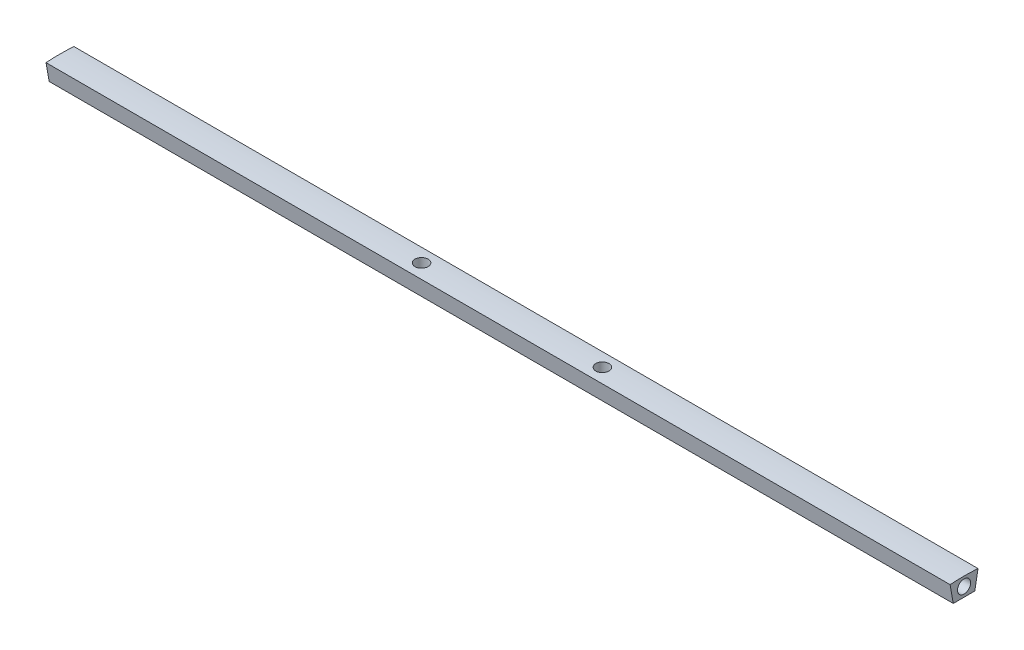
ISO-10303-21;
HEADER;
FILE_DESCRIPTION(('STEP AP214'),'2;1');
FILE_NAME('part.step','',(''),(''),'','','');
FILE_SCHEMA(('AUTOMOTIVE_DESIGN { 1 0 10303 214 1 1 1 1 }'));
ENDSEC;
DATA;
#1=APPLICATION_CONTEXT('core data for automotive mechanical design processes');
#2=APPLICATION_PROTOCOL_DEFINITION('international standard','automotive_design',2000,#1);
#3=PRODUCT_CONTEXT('',#1,'mechanical');
#4=PRODUCT('Part','Part','',(#3));
#5=PRODUCT_RELATED_PRODUCT_CATEGORY('part','',(#4));
#6=PRODUCT_DEFINITION_FORMATION('','',#4);
#7=PRODUCT_DEFINITION_CONTEXT('part definition',#1,'design');
#8=PRODUCT_DEFINITION('design','',#6,#7);
#9=PRODUCT_DEFINITION_SHAPE('','',#8);
#10=(LENGTH_UNIT() NAMED_UNIT(*) SI_UNIT(.MILLI.,.METRE.));
#11=(NAMED_UNIT(*) PLANE_ANGLE_UNIT() SI_UNIT($,.RADIAN.));
#12=(NAMED_UNIT(*) SI_UNIT($,.STERADIAN.) SOLID_ANGLE_UNIT());
#13=UNCERTAINTY_MEASURE_WITH_UNIT(LENGTH_MEASURE(1.E-05),#10,'distance_accuracy_value','');
#14=(GEOMETRIC_REPRESENTATION_CONTEXT(3) GLOBAL_UNCERTAINTY_ASSIGNED_CONTEXT((#13)) GLOBAL_UNIT_ASSIGNED_CONTEXT((#10,
#11,#12)) REPRESENTATION_CONTEXT('',''));
#15=CARTESIAN_POINT('',(0.,0.,0.));
#16=DIRECTION('',(0.,0.,1.));
#17=DIRECTION('',(1.,0.,0.));
#18=AXIS2_PLACEMENT_3D('',#15,#16,#17);
#19=CARTESIAN_POINT('',(100.,-27.3954375763557,0.));
#20=DIRECTION('',(-1.,0.,0.));
#21=DIRECTION('',(0.,0.,1.));
#22=AXIS2_PLACEMENT_3D('',#19,#20,#21);
#23=CYLINDRICAL_SURFACE('',#22,45.);
#24=CARTESIAN_POINT('',(-20.,17.5811952455887,-1.45));
#25=CARTESIAN_POINT('',(-19.9185755497555,17.581195560761,-1.44999639610573));
#26=CARTESIAN_POINT('',(-19.8370925971932,17.5814187337444,-1.44311841747033));
#27=CARTESIAN_POINT('',(-19.6763723313141,17.5822875221371,-1.41577711239342));
#28=CARTESIAN_POINT('',(-19.5971378150299,17.5829336415507,-1.39529757721871));
#29=CARTESIAN_POINT('',(-19.4432660134703,17.5845750552256,-1.34133816620006));
#30=CARTESIAN_POINT('',(-19.3686264918343,17.5855701780237,-1.30786467333882));
#31=CARTESIAN_POINT('',(-19.2260468688721,17.5877972491246,-1.22887674760692));
#32=CARTESIAN_POINT('',(-19.1581051423356,17.5890291397609,-1.18336524566251));
#33=CARTESIAN_POINT('',(-19.0307946192462,17.5915916607824,-1.08156652534249));
#34=CARTESIAN_POINT('',(-18.9714295130754,17.5929223333011,-1.02527469244733));
#35=CARTESIAN_POINT('',(-18.8629885047085,17.5955320587645,-0.903521480900382));
#36=CARTESIAN_POINT('',(-18.8139130131351,17.5968111096473,-0.838059736483198));
#37=CARTESIAN_POINT('',(-18.7274377940149,17.5991736442441,-0.699810266714487));
#38=CARTESIAN_POINT('',(-18.6900403912631,17.6002570890001,-0.627021086475463));
#39=CARTESIAN_POINT('',(-18.6279980145996,17.602105937575,-0.476193311351547));
#40=CARTESIAN_POINT('',(-18.6033529856492,17.6028713427666,-0.398154739124511));
#41=CARTESIAN_POINT('',(-18.567523177646,17.6039975967257,-0.239072314134422));
#42=CARTESIAN_POINT('',(-18.5563336912468,17.6043585869724,-0.158029522614945));
#43=CARTESIAN_POINT('',(-18.5477180910554,17.6046357939974,0.00478488025085344));
#44=CARTESIAN_POINT('',(-18.5502919177388,17.6045520126992,0.0865564884436184));
#45=CARTESIAN_POINT('',(-18.5691259176608,17.6039492413491,0.248475441193944));
#46=CARTESIAN_POINT('',(-18.5853810111596,17.603430412827,0.328623377298196));
#47=CARTESIAN_POINT('',(-18.6311082620197,17.6020162035603,0.485052254433794));
#48=CARTESIAN_POINT('',(-18.6605804507213,17.6011208219229,0.561333186295265));
#49=CARTESIAN_POINT('',(-18.7319111073349,17.5990541374583,0.707879059718868));
#50=CARTESIAN_POINT('',(-18.7737719018922,17.5978827828103,0.778142868034791));
#51=CARTESIAN_POINT('',(-18.8686897681545,17.5953961527433,0.9106475342358));
#52=CARTESIAN_POINT('',(-18.9217468700721,17.5940808769359,0.972888370470564));
#53=CARTESIAN_POINT('',(-19.0375800039693,17.5914539165918,1.0876099174053));
#54=CARTESIAN_POINT('',(-19.1003604435621,17.5901422339596,1.14008617793174));
#55=CARTESIAN_POINT('',(-19.2338426022834,17.5876709415424,1.23375469869195));
#56=CARTESIAN_POINT('',(-19.3045443227692,17.5865113317834,1.27494695699253));
#57=CARTESIAN_POINT('',(-19.4518645915983,17.5844749835096,1.34487769586793));
#58=CARTESIAN_POINT('',(-19.5284832094087,17.5835982483165,1.37361603020187));
#59=CARTESIAN_POINT('',(-19.6854612008433,17.582226646271,1.41782026852071));
#60=CARTESIAN_POINT('',(-19.7658205627223,17.5817317782196,1.43328621417523));
#61=CARTESIAN_POINT('',(-19.9279602042983,17.5811799277435,1.45050118830187));
#62=CARTESIAN_POINT('',(-20.0097398286705,17.5811227484762,1.45225638294296));
#63=CARTESIAN_POINT('',(-20.1724325696063,17.5814522093725,1.44201610203598));
#64=CARTESIAN_POINT('',(-20.2533456873345,17.5818388489395,1.43002064496979));
#65=CARTESIAN_POINT('',(-20.4119913625379,17.5830121829073,1.39262467641642));
#66=CARTESIAN_POINT('',(-20.4897245816199,17.5837987936284,1.36722696883111));
#67=CARTESIAN_POINT('',(-20.6398242090057,17.5856833255105,1.30375029232191));
#68=CARTESIAN_POINT('',(-20.7121906047513,17.5867812474,1.26567129372515));
#69=CARTESIAN_POINT('',(-20.8495307610811,17.5891651154822,1.17789707576103));
#70=CARTESIAN_POINT('',(-20.9145018669467,17.5904511288187,1.12819770440988));
#71=CARTESIAN_POINT('',(-21.0351804793051,17.5930659712476,1.018599619213));
#72=CARTESIAN_POINT('',(-21.090887959087,17.5943948004633,0.958700875959209));
#73=CARTESIAN_POINT('',(-21.1914785729168,17.5969460507688,0.830377941325694));
#74=CARTESIAN_POINT('',(-21.236357730029,17.5981684326585,0.761950631595954));
#75=CARTESIAN_POINT('',(-21.3139905509964,17.6003684382501,0.618528866792554));
#76=CARTESIAN_POINT('',(-21.3467442443823,17.6013460625482,0.543534427713156));
#77=CARTESIAN_POINT('',(-21.3991894068048,17.6029461639872,0.389122199102358));
#78=CARTESIAN_POINT('',(-21.4188834495715,17.6035687111016,0.309705284476179));
#79=CARTESIAN_POINT('',(-21.4446587085623,17.6043887602366,0.148690078274115));
#80=CARTESIAN_POINT('',(-21.4507399423086,17.6045862628042,0.067091789506192));
#81=CARTESIAN_POINT('',(-21.4491166661379,17.6045339642031,-0.0959301631536992));
#82=CARTESIAN_POINT('',(-21.4414184184504,17.6042843662238,-0.177353889541331));
#83=CARTESIAN_POINT('',(-21.4124675914789,17.6033663876483,-0.337752548323752));
#84=CARTESIAN_POINT('',(-21.3912149854502,17.6026980062259,-0.416727475886395));
#85=CARTESIAN_POINT('',(-21.335759663018,17.601017738147,-0.569988930491637));
#86=CARTESIAN_POINT('',(-21.3015567369522,17.6000058459292,-0.644275381606328));
#87=CARTESIAN_POINT('',(-21.2211736125113,17.5977525525986,-0.786050309944264));
#88=CARTESIAN_POINT('',(-21.1749938416078,17.5965111596776,-0.853539029669344));
#89=CARTESIAN_POINT('',(-21.0719486540127,17.5939381420972,-0.979832024541534));
#90=CARTESIAN_POINT('',(-21.0150795268562,17.592606486209,-1.03863327141638));
#91=CARTESIAN_POINT('',(-20.8922601580862,17.5900030367265,-1.14587017928332));
#92=CARTESIAN_POINT('',(-20.8263076725901,17.5887312580283,-1.1943032714316));
#93=CARTESIAN_POINT('',(-20.6871656913398,17.5863905082374,-1.27943850646351));
#94=CARTESIAN_POINT('',(-20.6139713405715,17.5853216746215,-1.31613270875393));
#95=CARTESIAN_POINT('',(-20.4625138171707,17.5835098212649,-1.3766687565962));
#96=CARTESIAN_POINT('',(-20.3842568093504,17.582766413515,-1.40052591573039));
#97=CARTESIAN_POINT('',(-20.2545884632373,17.5818878005388,-1.42839386265571));
#98=CARTESIAN_POINT('',(-20.2040186315184,17.5816292222113,-1.43648595639032));
#99=CARTESIAN_POINT('',(-20.1023068996895,17.5812828457423,-1.44729015643992));
#100=CARTESIAN_POINT('',(-20.0511649997749,17.5811950475426,-1.45000226459312));
#101=CARTESIAN_POINT('',(-20.,17.5811952455887,-1.45));
#102=B_SPLINE_CURVE_WITH_KNOTS('',3,(#24,#25,#26,#27,#28,#29,#30,#31,#32,#33,#34,#35,#36,#37,
#38,#39,#40,#41,#42,#43,#44,#45,#46,#47,#48,#49,#50,#51,#52,#53,#54,#55,#56,#57,#58,#59,#60,#61,
#62,#63,#64,#65,#66,#67,#68,#69,#70,#71,#72,#73,#74,#75,#76,#77,#78,#79,#80,#81,#82,#83,#84,#85,
#86,#87,#88,#89,#90,#91,#92,#93,#94,#95,#96,#97,#98,#99,#100,#101),.UNSPECIFIED.,.T.,.F.,(4,2,2,
2,2,2,2,2,2,2,2,2,2,2,2,2,2,2,2,2,2,2,2,2,2,2,2,2,2,2,2,2,2,2,2,2,2,2,4),(0.,0.24408659065921,
0.488464578135991,0.732722672151012,0.976921350648962,1.22122479295396,1.46553798270357,
1.70989977771351,1.9542605180567,2.19853574526446,2.44280991601687,2.68699342980523,
2.931177522602,3.1754075035857,3.41963814362032,3.66397981980311,3.90832153784673,
4.15266612500845,4.39700994502987,4.64124386938818,4.88547746547869,5.12965998539411,
5.37384307667462,5.6181135487785,5.86238472520444,6.10674547940481,6.35110563848043,
6.59541762596839,6.83972929898211,7.08392997018898,7.32813112323952,7.57233623001097,
7.81653262193724,8.06081393582274,8.30515570367844,8.54966240502629,8.7938767788072,
8.94725447538027,9.1006321195477),.UNSPECIFIED.);
#103=CARTESIAN_POINT('',(-20.,17.5811952455887,-1.45));
#104=VERTEX_POINT('',#103);
#105=EDGE_CURVE('E126',#104,#104,#102,.T.);
#106=ORIENTED_EDGE('',*,*,#105,.T.);
#107=EDGE_LOOP('',(#106));
#108=FACE_BOUND('',#107,.T.);
#109=CARTESIAN_POINT('',(20.,17.5811952455887,-1.45));
#110=CARTESIAN_POINT('',(20.0814244502446,17.581195560761,-1.44999639610573));
#111=CARTESIAN_POINT('',(20.1629074028068,17.5814187337444,-1.44311841747033));
#112=CARTESIAN_POINT('',(20.3236276686859,17.5822875221371,-1.41577711239342));
#113=CARTESIAN_POINT('',(20.4028621849702,17.5829336415507,-1.39529757721871));
#114=CARTESIAN_POINT('',(20.5567339865297,17.5845750552256,-1.34133816620006));
#115=CARTESIAN_POINT('',(20.6313735081658,17.5855701780237,-1.30786467333882));
#116=CARTESIAN_POINT('',(20.773953131128,17.5877972491246,-1.22887674760692));
#117=CARTESIAN_POINT('',(20.8418948576645,17.5890291397609,-1.18336524566251));
#118=CARTESIAN_POINT('',(20.9692053807538,17.5915916607824,-1.08156652534249));
#119=CARTESIAN_POINT('',(21.0285704869247,17.5929223333011,-1.02527469244733));
#120=CARTESIAN_POINT('',(21.1370114952915,17.5955320587645,-0.903521480900382));
#121=CARTESIAN_POINT('',(21.1860869868649,17.5968111096473,-0.838059736483198));
#122=CARTESIAN_POINT('',(21.2725622059851,17.5991736442441,-0.699810266714487));
#123=CARTESIAN_POINT('',(21.3099596087369,17.6002570890001,-0.627021086475463));
#124=CARTESIAN_POINT('',(21.3720019854004,17.602105937575,-0.476193311351547));
#125=CARTESIAN_POINT('',(21.3966470143509,17.6028713427666,-0.398154739124511));
#126=CARTESIAN_POINT('',(21.4324768223541,17.6039975967257,-0.239072314134422));
#127=CARTESIAN_POINT('',(21.4436663087532,17.6043585869724,-0.158029522614945));
#128=CARTESIAN_POINT('',(21.4522819089446,17.6046357939974,0.00478488025085344));
#129=CARTESIAN_POINT('',(21.4497080822612,17.6045520126992,0.0865564884436184));
#130=CARTESIAN_POINT('',(21.4308740823392,17.6039492413491,0.248475441193944));
#131=CARTESIAN_POINT('',(21.4146189888404,17.603430412827,0.328623377298196));
#132=CARTESIAN_POINT('',(21.3688917379803,17.6020162035603,0.485052254433794));
#133=CARTESIAN_POINT('',(21.3394195492788,17.6011208219229,0.561333186295265));
#134=CARTESIAN_POINT('',(21.2680888926651,17.5990541374583,0.707879059718868));
#135=CARTESIAN_POINT('',(21.2262280981078,17.5978827828103,0.778142868034791));
#136=CARTESIAN_POINT('',(21.1313102318455,17.5953961527433,0.9106475342358));
#137=CARTESIAN_POINT('',(21.0782531299279,17.5940808769359,0.972888370470564));
#138=CARTESIAN_POINT('',(20.9624199960307,17.5914539165918,1.0876099174053));
#139=CARTESIAN_POINT('',(20.899639556438,17.5901422339596,1.14008617793174));
#140=CARTESIAN_POINT('',(20.7661573977166,17.5876709415424,1.23375469869195));
#141=CARTESIAN_POINT('',(20.6954556772308,17.5865113317834,1.27494695699253));
#142=CARTESIAN_POINT('',(20.5481354084018,17.5844749835096,1.34487769586793));
#143=CARTESIAN_POINT('',(20.4715167905914,17.5835982483165,1.37361603020187));
#144=CARTESIAN_POINT('',(20.3145387991568,17.582226646271,1.41782026852071));
#145=CARTESIAN_POINT('',(20.2341794372777,17.5817317782196,1.43328621417523));
#146=CARTESIAN_POINT('',(20.0720397957017,17.5811799277435,1.45050118830187));
#147=CARTESIAN_POINT('',(19.9902601713296,17.5811227484762,1.45225638294296));
#148=CARTESIAN_POINT('',(19.8275674303938,17.5814522093725,1.44201610203598));
#149=CARTESIAN_POINT('',(19.7466543126656,17.5818388489395,1.43002064496979));
#150=CARTESIAN_POINT('',(19.5880086374621,17.5830121829073,1.39262467641642));
#151=CARTESIAN_POINT('',(19.5102754183801,17.5837987936284,1.36722696883111));
#152=CARTESIAN_POINT('',(19.3601757909943,17.5856833255105,1.30375029232191));
#153=CARTESIAN_POINT('',(19.2878093952487,17.5867812474,1.26567129372515));
#154=CARTESIAN_POINT('',(19.150469238919,17.5891651154822,1.17789707576103));
#155=CARTESIAN_POINT('',(19.0854981330533,17.5904511288187,1.12819770440988));
#156=CARTESIAN_POINT('',(18.9648195206949,17.5930659712476,1.018599619213));
#157=CARTESIAN_POINT('',(18.909112040913,17.5943948004633,0.958700875959209));
#158=CARTESIAN_POINT('',(18.8085214270832,17.5969460507688,0.830377941325694));
#159=CARTESIAN_POINT('',(18.763642269971,17.5981684326585,0.761950631595954));
#160=CARTESIAN_POINT('',(18.6860094490036,17.6003684382501,0.618528866792554));
#161=CARTESIAN_POINT('',(18.6532557556178,17.6013460625482,0.543534427713156));
#162=CARTESIAN_POINT('',(18.6008105931952,17.6029461639872,0.389122199102358));
#163=CARTESIAN_POINT('',(18.5811165504286,17.6035687111016,0.309705284476179));
#164=CARTESIAN_POINT('',(18.5553412914378,17.6043887602366,0.148690078274115));
#165=CARTESIAN_POINT('',(18.5492600576914,17.6045862628042,0.067091789506192));
#166=CARTESIAN_POINT('',(18.5508833338621,17.6045339642031,-0.0959301631536996));
#167=CARTESIAN_POINT('',(18.5585815815496,17.6042843662238,-0.177353889541332));
#168=CARTESIAN_POINT('',(18.5875324085212,17.6033663876483,-0.337752548323753));
#169=CARTESIAN_POINT('',(18.6087850145498,17.6026980062259,-0.416727475886395));
#170=CARTESIAN_POINT('',(18.6642403369821,17.601017738147,-0.569988930491637));
#171=CARTESIAN_POINT('',(18.6984432630479,17.6000058459292,-0.644275381606329));
#172=CARTESIAN_POINT('',(18.7788263874887,17.5977525525986,-0.786050309944265));
#173=CARTESIAN_POINT('',(18.8250061583923,17.5965111596776,-0.853539029669344));
#174=CARTESIAN_POINT('',(18.9280513459873,17.5939381420972,-0.979832024541534));
#175=CARTESIAN_POINT('',(18.9849204731438,17.592606486209,-1.03863327141638));
#176=CARTESIAN_POINT('',(19.1077398419138,17.5900030367265,-1.14587017928332));
#177=CARTESIAN_POINT('',(19.1736923274099,17.5887312580283,-1.1943032714316));
#178=CARTESIAN_POINT('',(19.3128343086602,17.5863905082374,-1.27943850646351));
#179=CARTESIAN_POINT('',(19.3860286594286,17.5853216746215,-1.31613270875393));
#180=CARTESIAN_POINT('',(19.5374861828293,17.5835098212649,-1.3766687565962));
#181=CARTESIAN_POINT('',(19.6157431906496,17.582766413515,-1.40052591573039));
#182=CARTESIAN_POINT('',(19.7454115367628,17.5818878005388,-1.42839386265571));
#183=CARTESIAN_POINT('',(19.7959813684817,17.5816292222113,-1.43648595639032));
#184=CARTESIAN_POINT('',(19.8976931003106,17.5812828457423,-1.44729015643992));
#185=CARTESIAN_POINT('',(19.9488350002251,17.5811950475426,-1.45000226459312));
#186=CARTESIAN_POINT('',(20.,17.5811952455887,-1.45));
#187=B_SPLINE_CURVE_WITH_KNOTS('',3,(#109,#110,#111,#112,#113,#114,#115,#116,#117,#118,#119,
#120,#121,#122,#123,#124,#125,#126,#127,#128,#129,#130,#131,#132,#133,#134,#135,#136,#137,#138,
#139,#140,#141,#142,#143,#144,#145,#146,#147,#148,#149,#150,#151,#152,#153,#154,#155,#156,#157,
#158,#159,#160,#161,#162,#163,#164,#165,#166,#167,#168,#169,#170,#171,#172,#173,#174,#175,#176,
#177,#178,#179,#180,#181,#182,#183,#184,#185,#186),.UNSPECIFIED.,.T.,.F.,(4,2,2,2,2,2,2,2,2,2,2,
2,2,2,2,2,2,2,2,2,2,2,2,2,2,2,2,2,2,2,2,2,2,2,2,2,2,2,4),(0.,0.24408659065921,0.488464578135991,
0.732722672151007,0.976921350648962,1.22122479295396,1.46553798270357,1.70989977771351,
1.9542605180567,2.19853574526446,2.44280991601687,2.68699342980523,2.931177522602,
3.1754075035857,3.41963814362032,3.66397981980311,3.90832153784673,4.15266612500845,
4.39700994502987,4.64124386938818,4.88547746547869,5.12965998539411,5.37384307667462,
5.6181135487785,5.86238472520444,6.10674547940481,6.35110563848043,6.59541762596839,
6.83972929898211,7.08392997018898,7.32813112323952,7.57233623001097,7.81653262193724,
8.06081393582273,8.30515570367844,8.54966240502628,8.79387677880719,8.94725447538026,
9.1006321195477),.UNSPECIFIED.);
#188=CARTESIAN_POINT('',(20.,17.5811952455887,-1.45));
#189=VERTEX_POINT('',#188);
#190=EDGE_CURVE('E135',#189,#189,#187,.T.);
#191=ORIENTED_EDGE('',*,*,#190,.T.);
#192=EDGE_LOOP('',(#191));
#193=FACE_BOUND('',#192,.T.);
#194=CARTESIAN_POINT('',(-100.,-27.3954375763557,0.));
#195=DIRECTION('',(1.,0.,0.));
#196=DIRECTION('',(0.,0.,1.));
#197=AXIS2_PLACEMENT_3D('',#194,#195,#196);
#198=CIRCLE('',#197,45.);
#199=CARTESIAN_POINT('',(-100.,17.4986575754162,-3.08548545672432));
#200=VERTEX_POINT('',#199);
#201=CARTESIAN_POINT('',(-100.,17.4986575754162,3.08548545672432));
#202=VERTEX_POINT('',#201);
#203=EDGE_CURVE('E103',#200,#202,#198,.T.);
#204=ORIENTED_EDGE('',*,*,#203,.T.);
#205=DIRECTION('',(-1.,0.,0.));
#206=VECTOR('',#205,1.);
#207=CARTESIAN_POINT('',(100.,17.4986575754162,3.08548545672432));
#208=LINE('',#207,#206);
#209=CARTESIAN_POINT('',(100.,17.4986575754162,3.08548545672432));
#210=VERTEX_POINT('',#209);
#211=EDGE_CURVE('E11',#210,#202,#208,.T.);
#212=ORIENTED_EDGE('',*,*,#211,.F.);
#213=CARTESIAN_POINT('',(100.,-27.3954375763557,0.));
#214=DIRECTION('',(1.,0.,0.));
#215=DIRECTION('',(0.,0.,1.));
#216=AXIS2_PLACEMENT_3D('',#213,#214,#215);
#217=CIRCLE('',#216,45.);
#218=CARTESIAN_POINT('',(100.,17.4986575754162,-3.08548545672432));
#219=VERTEX_POINT('',#218);
#220=EDGE_CURVE('E91',#219,#210,#217,.T.);
#221=ORIENTED_EDGE('',*,*,#220,.F.);
#222=DIRECTION('',(-1.,0.,0.));
#223=VECTOR('',#222,1.);
#224=CARTESIAN_POINT('',(100.,17.4986575754162,-3.08548545672432));
#225=LINE('',#224,#223);
#226=EDGE_CURVE('E99',#219,#200,#225,.T.);
#227=ORIENTED_EDGE('',*,*,#226,.T.);
#228=EDGE_LOOP('',(#204,#212,#221,#227));
#229=FACE_BOUND('',#228,.T.);
#230=ADVANCED_FACE('F39',(#108,#193,#229),#23,.T.);
#231=CARTESIAN_POINT('',(100.,17.4986575754162,3.08548545672432));
#232=DIRECTION('',(0.,0.173648177666924,-0.984807753012209));
#233=DIRECTION('',(0.,0.984807753012209,0.173648177666924));
#234=AXIS2_PLACEMENT_3D('',#231,#232,#233);
#235=PLANE('',#234);
#236=DIRECTION('',(0.,-0.984807753012209,-0.173648177666924));
#237=VECTOR('',#236,1.);
#238=CARTESIAN_POINT('',(-100.,17.4986575754162,3.08548545672432));
#239=LINE('',#238,#237);
#240=CARTESIAN_POINT('',(-100.,13.5350421822687,2.38659312176107));
#241=VERTEX_POINT('',#240);
#242=EDGE_CURVE('E95',#202,#241,#239,.T.);
#243=ORIENTED_EDGE('',*,*,#242,.T.);
#244=DIRECTION('',(-1.,0.,0.));
#245=VECTOR('',#244,1.);
#246=CARTESIAN_POINT('',(100.,13.5350421822687,2.38659312176107));
#247=LINE('',#246,#245);
#248=CARTESIAN_POINT('',(100.,13.5350421822687,2.38659312176107));
#249=VERTEX_POINT('',#248);
#250=EDGE_CURVE('E48',#249,#241,#247,.T.);
#251=ORIENTED_EDGE('',*,*,#250,.F.);
#252=DIRECTION('',(0.,-0.984807753012209,-0.173648177666924));
#253=VECTOR('',#252,1.);
#254=CARTESIAN_POINT('',(100.,17.4986575754162,3.08548545672432));
#255=LINE('',#254,#253);
#256=EDGE_CURVE('E86',#210,#249,#255,.T.);
#257=ORIENTED_EDGE('',*,*,#256,.F.);
#258=ORIENTED_EDGE('',*,*,#211,.T.);
#259=EDGE_LOOP('',(#243,#251,#257,#258));
#260=FACE_BOUND('',#259,.T.);
#261=ADVANCED_FACE('F94',(#260),#235,.F.);
#262=CARTESIAN_POINT('',(100.,13.5350421822687,2.38659312176107));
#263=DIRECTION('',(0.,1.,0.));
#264=DIRECTION('',(0.,0.,1.));
#265=AXIS2_PLACEMENT_3D('',#262,#263,#264);
#266=PLANE('',#265);
#267=CARTESIAN_POINT('',(-20.,13.5350421822687,0.));
#268=DIRECTION('',(0.,-1.,0.));
#269=DIRECTION('',(0.,0.,-1.));
#270=AXIS2_PLACEMENT_3D('',#267,#268,#269);
#271=CIRCLE('',#270,1.45);
#272=CARTESIAN_POINT('',(-20.,13.5350421822687,-1.45));
#273=VERTEX_POINT('',#272);
#274=EDGE_CURVE('E188',#273,#273,#271,.T.);
#275=ORIENTED_EDGE('',*,*,#274,.F.);
#276=EDGE_LOOP('',(#275));
#277=FACE_BOUND('',#276,.T.);
#278=CARTESIAN_POINT('',(20.,13.5350421822687,0.));
#279=DIRECTION('',(0.,-1.,0.));
#280=DIRECTION('',(0.,0.,-1.));
#281=AXIS2_PLACEMENT_3D('',#278,#279,#280);
#282=CIRCLE('',#281,1.45);
#283=CARTESIAN_POINT('',(20.,13.5350421822687,-1.45));
#284=VERTEX_POINT('',#283);
#285=EDGE_CURVE('E190',#284,#284,#282,.T.);
#286=ORIENTED_EDGE('',*,*,#285,.F.);
#287=EDGE_LOOP('',(#286));
#288=FACE_BOUND('',#287,.T.);
#289=DIRECTION('',(0.,0.,-1.));
#290=VECTOR('',#289,1.);
#291=CARTESIAN_POINT('',(-100.,13.5350421822687,2.38659312176107));
#292=LINE('',#291,#290);
#293=CARTESIAN_POINT('',(-100.,13.5350421822687,-2.38659312176107));
#294=VERTEX_POINT('',#293);
#295=EDGE_CURVE('E73',#241,#294,#292,.T.);
#296=ORIENTED_EDGE('',*,*,#295,.T.);
#297=DIRECTION('',(-1.,0.,0.));
#298=VECTOR('',#297,1.);
#299=CARTESIAN_POINT('',(100.,13.5350421822687,-2.38659312176107));
#300=LINE('',#299,#298);
#301=CARTESIAN_POINT('',(100.,13.5350421822687,-2.38659312176107));
#302=VERTEX_POINT('',#301);
#303=EDGE_CURVE('E96',#302,#294,#300,.T.);
#304=ORIENTED_EDGE('',*,*,#303,.F.);
#305=DIRECTION('',(0.,0.,-1.));
#306=VECTOR('',#305,1.);
#307=CARTESIAN_POINT('',(100.,13.5350421822687,2.38659312176107));
#308=LINE('',#307,#306);
#309=EDGE_CURVE('E89',#249,#302,#308,.T.);
#310=ORIENTED_EDGE('',*,*,#309,.F.);
#311=ORIENTED_EDGE('',*,*,#250,.T.);
#312=EDGE_LOOP('',(#296,#304,#310,#311));
#313=FACE_BOUND('',#312,.T.);
#314=ADVANCED_FACE('F97',(#277,#288,#313),#266,.F.);
#315=CARTESIAN_POINT('',(100.,13.5350421822687,-2.38659312176107));
#316=DIRECTION('',(0.,0.173648177666924,0.984807753012209));
#317=DIRECTION('',(0.,-0.984807753012209,0.173648177666924));
#318=AXIS2_PLACEMENT_3D('',#315,#316,#317);
#319=PLANE('',#318);
#320=DIRECTION('',(0.,0.984807753012209,-0.173648177666924));
#321=VECTOR('',#320,1.);
#322=CARTESIAN_POINT('',(-100.,13.5350421822687,-2.38659312176107));
#323=LINE('',#322,#321);
#324=EDGE_CURVE('E79',#294,#200,#323,.T.);
#325=ORIENTED_EDGE('',*,*,#324,.T.);
#326=ORIENTED_EDGE('',*,*,#226,.F.);
#327=DIRECTION('',(0.,0.984807753012209,-0.173648177666924));
#328=VECTOR('',#327,1.);
#329=CARTESIAN_POINT('',(100.,13.5350421822687,-2.38659312176107));
#330=LINE('',#329,#328);
#331=EDGE_CURVE('E56',#302,#219,#330,.T.);
#332=ORIENTED_EDGE('',*,*,#331,.F.);
#333=ORIENTED_EDGE('',*,*,#303,.T.);
#334=EDGE_LOOP('',(#325,#326,#332,#333));
#335=FACE_BOUND('',#334,.T.);
#336=ADVANCED_FACE('F111',(#335),#319,.F.);
#337=CARTESIAN_POINT('',(100.,-27.3954375763557,0.));
#338=DIRECTION('',(-1.,0.,0.));
#339=DIRECTION('',(0.,0.,1.));
#340=AXIS2_PLACEMENT_3D('',#337,#338,#339);
#341=PLANE('',#340);
#342=CARTESIAN_POINT('',(100.,15.6045624236443,0.));
#343=DIRECTION('',(1.,0.,0.));
#344=DIRECTION('',(0.,0.,-1.));
#345=AXIS2_PLACEMENT_3D('',#342,#343,#344);
#346=CIRCLE('',#345,1.45);
#347=CARTESIAN_POINT('',(100.,15.6045624236443,-1.45));
#348=VERTEX_POINT('',#347);
#349=EDGE_CURVE('E117',#348,#348,#346,.T.);
#350=ORIENTED_EDGE('',*,*,#349,.F.);
#351=EDGE_LOOP('',(#350));
#352=FACE_BOUND('',#351,.T.);
#353=ORIENTED_EDGE('',*,*,#220,.T.);
#354=ORIENTED_EDGE('',*,*,#256,.T.);
#355=ORIENTED_EDGE('',*,*,#309,.T.);
#356=ORIENTED_EDGE('',*,*,#331,.T.);
#357=EDGE_LOOP('',(#353,#354,#355,#356));
#358=FACE_BOUND('',#357,.T.);
#359=ADVANCED_FACE('F87',(#352,#358),#341,.F.);
#360=CARTESIAN_POINT('',(-100.,-27.3954375763557,0.));
#361=DIRECTION('',(-1.,0.,0.));
#362=DIRECTION('',(0.,0.,1.));
#363=AXIS2_PLACEMENT_3D('',#360,#361,#362);
#364=PLANE('',#363);
#365=CARTESIAN_POINT('',(-100.,15.6045624236443,0.));
#366=DIRECTION('',(1.,0.,0.));
#367=DIRECTION('',(0.,0.,-1.));
#368=AXIS2_PLACEMENT_3D('',#365,#366,#367);
#369=CIRCLE('',#368,1.45);
#370=CARTESIAN_POINT('',(-100.,15.6045624236443,-1.45));
#371=VERTEX_POINT('',#370);
#372=EDGE_CURVE('E123',#371,#371,#369,.T.);
#373=ORIENTED_EDGE('',*,*,#372,.T.);
#374=EDGE_LOOP('',(#373));
#375=FACE_BOUND('',#374,.T.);
#376=ORIENTED_EDGE('',*,*,#203,.F.);
#377=ORIENTED_EDGE('',*,*,#324,.F.);
#378=ORIENTED_EDGE('',*,*,#295,.F.);
#379=ORIENTED_EDGE('',*,*,#242,.F.);
#380=EDGE_LOOP('',(#376,#377,#378,#379));
#381=FACE_BOUND('',#380,.T.);
#382=ADVANCED_FACE('F114',(#375,#381),#364,.T.);
#383=CARTESIAN_POINT('',(90.,15.6045624236443,0.));
#384=DIRECTION('',(1.,0.,0.));
#385=DIRECTION('',(0.,0.,-1.));
#386=AXIS2_PLACEMENT_3D('',#383,#384,#385);
#387=CYLINDRICAL_SURFACE('',#386,1.45);
#388=CARTESIAN_POINT('',(90.,15.6045624236443,0.));
#389=DIRECTION('',(1.,0.,0.));
#390=DIRECTION('',(0.,0.,-1.));
#391=AXIS2_PLACEMENT_3D('',#388,#389,#390);
#392=CIRCLE('',#391,1.45);
#393=CARTESIAN_POINT('',(90.,15.6045624236443,-1.45));
#394=VERTEX_POINT('',#393);
#395=EDGE_CURVE('E106',#394,#394,#392,.T.);
#396=ORIENTED_EDGE('',*,*,#395,.F.);
#397=EDGE_LOOP('',(#396));
#398=FACE_BOUND('',#397,.T.);
#399=ORIENTED_EDGE('',*,*,#349,.T.);
#400=EDGE_LOOP('',(#399));
#401=FACE_BOUND('',#400,.T.);
#402=ADVANCED_FACE('F161',(#398,#401),#387,.F.);
#403=CARTESIAN_POINT('',(90.,15.6045624236443,0.));
#404=DIRECTION('',(1.,0.,0.));
#405=DIRECTION('',(0.,0.,-1.));
#406=AXIS2_PLACEMENT_3D('',#403,#404,#405);
#407=PLANE('',#406);
#408=ORIENTED_EDGE('',*,*,#395,.T.);
#409=EDGE_LOOP('',(#408));
#410=FACE_BOUND('',#409,.T.);
#411=ADVANCED_FACE('F157',(#410),#407,.T.);
#412=CARTESIAN_POINT('',(-90.,15.6045624236443,0.));
#413=DIRECTION('',(-1.,0.,0.));
#414=DIRECTION('',(0.,0.,1.));
#415=AXIS2_PLACEMENT_3D('',#412,#413,#414);
#416=CYLINDRICAL_SURFACE('',#415,1.45);
#417=CARTESIAN_POINT('',(-90.,15.6045624236443,0.));
#418=DIRECTION('',(1.,0.,0.));
#419=DIRECTION('',(0.,0.,-1.));
#420=AXIS2_PLACEMENT_3D('',#417,#418,#419);
#421=CIRCLE('',#420,1.45);
#422=CARTESIAN_POINT('',(-90.,15.6045624236443,-1.45));
#423=VERTEX_POINT('',#422);
#424=EDGE_CURVE('E120',#423,#423,#421,.T.);
#425=ORIENTED_EDGE('',*,*,#424,.T.);
#426=EDGE_LOOP('',(#425));
#427=FACE_BOUND('',#426,.T.);
#428=ORIENTED_EDGE('',*,*,#372,.F.);
#429=EDGE_LOOP('',(#428));
#430=FACE_BOUND('',#429,.T.);
#431=ADVANCED_FACE('F153',(#427,#430),#416,.F.);
#432=CARTESIAN_POINT('',(-90.,15.6045624236443,0.));
#433=DIRECTION('',(-1.,0.,0.));
#434=DIRECTION('',(0.,0.,-1.));
#435=AXIS2_PLACEMENT_3D('',#432,#433,#434);
#436=PLANE('',#435);
#437=ORIENTED_EDGE('',*,*,#424,.F.);
#438=EDGE_LOOP('',(#437));
#439=FACE_BOUND('',#438,.T.);
#440=ADVANCED_FACE('F149',(#439),#436,.T.);
#441=CARTESIAN_POINT('',(20.,23.5350421822687,0.));
#442=DIRECTION('',(0.,-1.,0.));
#443=DIRECTION('',(0.,0.,-1.));
#444=AXIS2_PLACEMENT_3D('',#441,#442,#443);
#445=CYLINDRICAL_SURFACE('',#444,1.45);
#446=ORIENTED_EDGE('',*,*,#285,.T.);
#447=EDGE_LOOP('',(#446));
#448=FACE_BOUND('',#447,.T.);
#449=ORIENTED_EDGE('',*,*,#190,.F.);
#450=EDGE_LOOP('',(#449));
#451=FACE_BOUND('',#450,.T.);
#452=ADVANCED_FACE('F144',(#448,#451),#445,.F.);
#453=CARTESIAN_POINT('',(-20.,23.5350421822687,0.));
#454=DIRECTION('',(0.,-1.,0.));
#455=DIRECTION('',(0.,0.,-1.));
#456=AXIS2_PLACEMENT_3D('',#453,#454,#455);
#457=CYLINDRICAL_SURFACE('',#456,1.45);
#458=ORIENTED_EDGE('',*,*,#274,.T.);
#459=EDGE_LOOP('',(#458));
#460=FACE_BOUND('',#459,.T.);
#461=ORIENTED_EDGE('',*,*,#105,.F.);
#462=EDGE_LOOP('',(#461));
#463=FACE_BOUND('',#462,.T.);
#464=ADVANCED_FACE('F141',(#460,#463),#457,.F.);
#465=CLOSED_SHELL('',(#230,#261,#314,#336,#359,#382,#402,#411,#431,#440,#452,#464));
#466=MANIFOLD_SOLID_BREP('B2',#465);
#467=ADVANCED_BREP_SHAPE_REPRESENTATION('',(#18,#466),#14);
#468=SHAPE_DEFINITION_REPRESENTATION(#9,#467);
ENDSEC;
END-ISO-10303-21;
